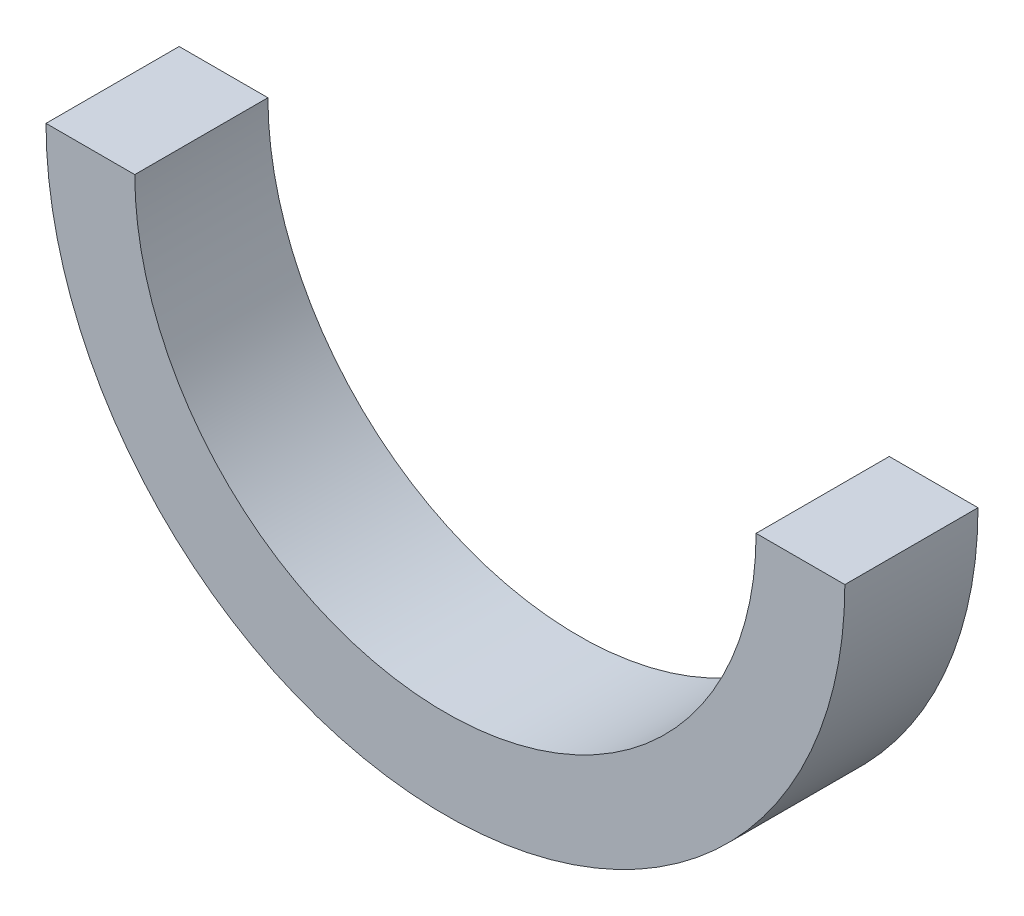
ISO-10303-21;
HEADER;
FILE_DESCRIPTION(('STEP AP214'),'2;1');
FILE_NAME('part.step','',(''),(''),'','','');
FILE_SCHEMA(('AUTOMOTIVE_DESIGN { 1 0 10303 214 1 1 1 1 }'));
ENDSEC;
DATA;
#1=APPLICATION_CONTEXT('core data for automotive mechanical design processes');
#2=APPLICATION_PROTOCOL_DEFINITION('international standard','automotive_design',2000,#1);
#3=PRODUCT_CONTEXT('',#1,'mechanical');
#4=PRODUCT('Part','Part','',(#3));
#5=PRODUCT_RELATED_PRODUCT_CATEGORY('part','',(#4));
#6=PRODUCT_DEFINITION_FORMATION('','',#4);
#7=PRODUCT_DEFINITION_CONTEXT('part definition',#1,'design');
#8=PRODUCT_DEFINITION('design','',#6,#7);
#9=PRODUCT_DEFINITION_SHAPE('','',#8);
#10=(LENGTH_UNIT() NAMED_UNIT(*) SI_UNIT(.MILLI.,.METRE.));
#11=(NAMED_UNIT(*) PLANE_ANGLE_UNIT() SI_UNIT($,.RADIAN.));
#12=(NAMED_UNIT(*) SI_UNIT($,.STERADIAN.) SOLID_ANGLE_UNIT());
#13=UNCERTAINTY_MEASURE_WITH_UNIT(LENGTH_MEASURE(1.E-05),#10,'distance_accuracy_value','');
#14=(GEOMETRIC_REPRESENTATION_CONTEXT(3) GLOBAL_UNCERTAINTY_ASSIGNED_CONTEXT((#13)) GLOBAL_UNIT_ASSIGNED_CONTEXT((#10,
#11,#12)) REPRESENTATION_CONTEXT('',''));
#15=CARTESIAN_POINT('',(0.,0.,0.));
#16=DIRECTION('',(0.,0.,1.));
#17=DIRECTION('',(1.,0.,0.));
#18=AXIS2_PLACEMENT_3D('',#15,#16,#17);
#19=CARTESIAN_POINT('',(0.,0.,210.));
#20=DIRECTION('',(0.,0.,1.));
#21=DIRECTION('',(1.,0.,0.));
#22=AXIS2_PLACEMENT_3D('',#19,#20,#21);
#23=CYLINDRICAL_SURFACE('',#22,35.);
#24=DIRECTION('',(0.,0.,1.));
#25=VECTOR('',#24,1.);
#26=CARTESIAN_POINT('',(35.,0.,210.));
#27=LINE('',#26,#25);
#28=CARTESIAN_POINT('',(35.,0.,-7.50000000000001));
#29=VERTEX_POINT('',#28);
#30=CARTESIAN_POINT('',(35.,0.,7.50000000000001));
#31=VERTEX_POINT('',#30);
#32=EDGE_CURVE('E46',#29,#31,#27,.T.);
#33=ORIENTED_EDGE('',*,*,#32,.F.);
#34=CARTESIAN_POINT('',(0.,0.,-7.50000000000001));
#35=DIRECTION('',(0.,0.,1.));
#36=DIRECTION('',(1.,0.,0.));
#37=AXIS2_PLACEMENT_3D('',#34,#35,#36);
#38=CIRCLE('',#37,35.);
#39=CARTESIAN_POINT('',(-35.,0.,-7.50000000000001));
#40=VERTEX_POINT('',#39);
#41=EDGE_CURVE('E76',#40,#29,#38,.T.);
#42=ORIENTED_EDGE('',*,*,#41,.F.);
#43=DIRECTION('',(0.,0.,1.));
#44=VECTOR('',#43,1.);
#45=CARTESIAN_POINT('',(-35.,0.,210.));
#46=LINE('',#45,#44);
#47=CARTESIAN_POINT('',(-35.,0.,7.50000000000001));
#48=VERTEX_POINT('',#47);
#49=EDGE_CURVE('E90',#48,#40,#46,.F.);
#50=ORIENTED_EDGE('',*,*,#49,.F.);
#51=CARTESIAN_POINT('',(0.,0.,7.50000000000001));
#52=DIRECTION('',(0.,0.,1.));
#53=DIRECTION('',(1.,0.,0.));
#54=AXIS2_PLACEMENT_3D('',#51,#52,#53);
#55=CIRCLE('',#54,35.);
#56=EDGE_CURVE('E87',#48,#31,#55,.T.);
#57=ORIENTED_EDGE('',*,*,#56,.T.);
#58=EDGE_LOOP('',(#33,#42,#50,#57));
#59=FACE_BOUND('',#58,.T.);
#60=ADVANCED_FACE('F32',(#59),#23,.F.);
#61=CARTESIAN_POINT('',(35.,0.,-7.5));
#62=DIRECTION('',(0.,0.,-1.));
#63=DIRECTION('',(-1.,0.,0.));
#64=AXIS2_PLACEMENT_3D('',#61,#62,#63);
#65=PLANE('',#64);
#66=DIRECTION('',(-1.,0.,0.));
#67=VECTOR('',#66,1.);
#68=CARTESIAN_POINT('',(35.,0.,-7.5));
#69=LINE('',#68,#67);
#70=CARTESIAN_POINT('',(45.,0.,-7.50000000000001));
#71=VERTEX_POINT('',#70);
#72=EDGE_CURVE('E84',#71,#29,#69,.T.);
#73=ORIENTED_EDGE('',*,*,#72,.F.);
#74=CARTESIAN_POINT('',(0.,0.,-7.50000000000001));
#75=DIRECTION('',(0.,0.,1.));
#76=DIRECTION('',(1.,0.,0.));
#77=AXIS2_PLACEMENT_3D('',#74,#75,#76);
#78=CIRCLE('',#77,45.);
#79=CARTESIAN_POINT('',(-45.,0.,-7.50000000000001));
#80=VERTEX_POINT('',#79);
#81=EDGE_CURVE('E83',#80,#71,#78,.T.);
#82=ORIENTED_EDGE('',*,*,#81,.F.);
#83=EDGE_CURVE('E98',#40,#80,#69,.T.);
#84=ORIENTED_EDGE('',*,*,#83,.F.);
#85=ORIENTED_EDGE('',*,*,#41,.T.);
#86=EDGE_LOOP('',(#73,#82,#84,#85));
#87=FACE_BOUND('',#86,.T.);
#88=ADVANCED_FACE('F97',(#87),#65,.T.);
#89=CARTESIAN_POINT('',(0.,0.,210.));
#90=DIRECTION('',(0.,0.,1.));
#91=DIRECTION('',(1.,0.,0.));
#92=AXIS2_PLACEMENT_3D('',#89,#90,#91);
#93=CYLINDRICAL_SURFACE('',#92,45.);
#94=DIRECTION('',(0.,0.,1.));
#95=VECTOR('',#94,1.);
#96=CARTESIAN_POINT('',(45.,0.,210.));
#97=LINE('',#96,#95);
#98=CARTESIAN_POINT('',(45.,0.,7.5));
#99=VERTEX_POINT('',#98);
#100=EDGE_CURVE('E70',#99,#71,#97,.F.);
#101=ORIENTED_EDGE('',*,*,#100,.F.);
#102=CARTESIAN_POINT('',(0.,0.,7.50000000000001));
#103=DIRECTION('',(0.,0.,1.));
#104=DIRECTION('',(1.,0.,0.));
#105=AXIS2_PLACEMENT_3D('',#102,#103,#104);
#106=CIRCLE('',#105,45.);
#107=CARTESIAN_POINT('',(-45.,0.,7.50000000000001));
#108=VERTEX_POINT('',#107);
#109=EDGE_CURVE('E81',#108,#99,#106,.T.);
#110=ORIENTED_EDGE('',*,*,#109,.F.);
#111=DIRECTION('',(0.,0.,1.));
#112=VECTOR('',#111,1.);
#113=CARTESIAN_POINT('',(-45.,0.,210.));
#114=LINE('',#113,#112);
#115=EDGE_CURVE('E53',#80,#108,#114,.T.);
#116=ORIENTED_EDGE('',*,*,#115,.F.);
#117=ORIENTED_EDGE('',*,*,#81,.T.);
#118=EDGE_LOOP('',(#101,#110,#116,#117));
#119=FACE_BOUND('',#118,.T.);
#120=ADVANCED_FACE('F80',(#119),#93,.T.);
#121=CARTESIAN_POINT('',(35.,0.,7.5));
#122=DIRECTION('',(0.,0.,1.));
#123=DIRECTION('',(1.,0.,0.));
#124=AXIS2_PLACEMENT_3D('',#121,#122,#123);
#125=PLANE('',#124);
#126=DIRECTION('',(1.,0.,0.));
#127=VECTOR('',#126,1.);
#128=CARTESIAN_POINT('',(35.,0.,7.5));
#129=LINE('',#128,#127);
#130=EDGE_CURVE('E11',#108,#48,#129,.T.);
#131=ORIENTED_EDGE('',*,*,#130,.F.);
#132=ORIENTED_EDGE('',*,*,#109,.T.);
#133=EDGE_CURVE('E35',#31,#99,#129,.T.);
#134=ORIENTED_EDGE('',*,*,#133,.F.);
#135=ORIENTED_EDGE('',*,*,#56,.F.);
#136=EDGE_LOOP('',(#131,#132,#134,#135));
#137=FACE_BOUND('',#136,.T.);
#138=ADVANCED_FACE('F86',(#137),#125,.T.);
#139=CARTESIAN_POINT('',(-78.528946402289,0.,-15.));
#140=DIRECTION('',(0.,-1.,0.));
#141=DIRECTION('',(0.,0.,-1.));
#142=AXIS2_PLACEMENT_3D('',#139,#140,#141);
#143=PLANE('',#142);
#144=ORIENTED_EDGE('',*,*,#32,.T.);
#145=ORIENTED_EDGE('',*,*,#133,.T.);
#146=ORIENTED_EDGE('',*,*,#100,.T.);
#147=ORIENTED_EDGE('',*,*,#72,.T.);
#148=EDGE_LOOP('',(#144,#145,#146,#147));
#149=FACE_BOUND('',#148,.T.);
#150=ADVANCED_FACE('F69',(#149),#143,.F.);
#151=ORIENTED_EDGE('',*,*,#49,.T.);
#152=ORIENTED_EDGE('',*,*,#83,.T.);
#153=ORIENTED_EDGE('',*,*,#115,.T.);
#154=ORIENTED_EDGE('',*,*,#130,.T.);
#155=EDGE_LOOP('',(#151,#152,#153,#154));
#156=FACE_BOUND('',#155,.T.);
#157=ADVANCED_FACE('F104',(#156),#143,.F.);
#158=CLOSED_SHELL('',(#60,#88,#120,#138,#150,#157));
#159=MANIFOLD_SOLID_BREP('B2',#158);
#160=ADVANCED_BREP_SHAPE_REPRESENTATION('',(#18,#159),#14);
#161=SHAPE_DEFINITION_REPRESENTATION(#9,#160);
ENDSEC;
END-ISO-10303-21;
